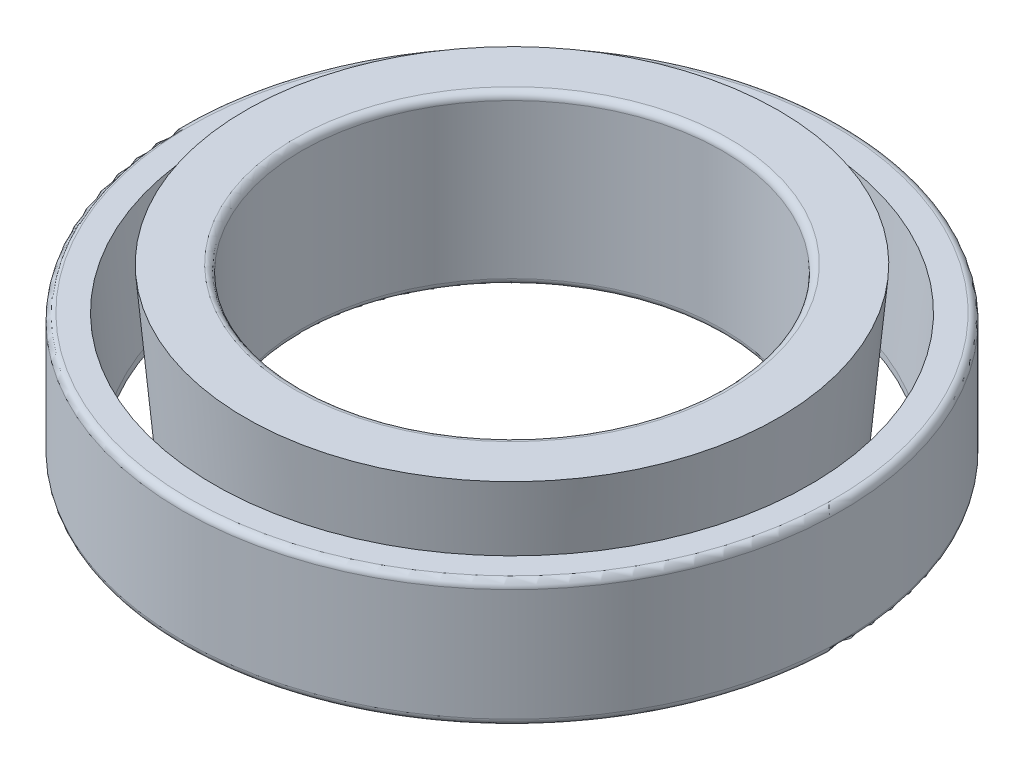
ISO-10303-21;
HEADER;
FILE_DESCRIPTION(('STEP AP214'),'2;1');
FILE_NAME('part.step','',(''),(''),'','','');
FILE_SCHEMA(('AUTOMOTIVE_DESIGN { 1 0 10303 214 1 1 1 1 }'));
ENDSEC;
DATA;
#1=APPLICATION_CONTEXT('core data for automotive mechanical design processes');
#2=APPLICATION_PROTOCOL_DEFINITION('international standard','automotive_design',2000,#1);
#3=PRODUCT_CONTEXT('',#1,'mechanical');
#4=PRODUCT('Part','Part','',(#3));
#5=PRODUCT_RELATED_PRODUCT_CATEGORY('part','',(#4));
#6=PRODUCT_DEFINITION_FORMATION('','',#4);
#7=PRODUCT_DEFINITION_CONTEXT('part definition',#1,'design');
#8=PRODUCT_DEFINITION('design','',#6,#7);
#9=PRODUCT_DEFINITION_SHAPE('','',#8);
#10=(LENGTH_UNIT() NAMED_UNIT(*) SI_UNIT(.MILLI.,.METRE.));
#11=(NAMED_UNIT(*) PLANE_ANGLE_UNIT() SI_UNIT($,.RADIAN.));
#12=(NAMED_UNIT(*) SI_UNIT($,.STERADIAN.) SOLID_ANGLE_UNIT());
#13=UNCERTAINTY_MEASURE_WITH_UNIT(LENGTH_MEASURE(1.E-05),#10,'distance_accuracy_value','');
#14=(GEOMETRIC_REPRESENTATION_CONTEXT(3) GLOBAL_UNCERTAINTY_ASSIGNED_CONTEXT((#13)) GLOBAL_UNIT_ASSIGNED_CONTEXT((#10,
#11,#12)) REPRESENTATION_CONTEXT('',''));
#15=CARTESIAN_POINT('',(0.,0.,0.));
#16=DIRECTION('',(0.,0.,1.));
#17=DIRECTION('',(1.,0.,0.));
#18=AXIS2_PLACEMENT_3D('',#15,#16,#17);
#19=CARTESIAN_POINT('',(0.,9.,0.));
#20=DIRECTION('',(0.,1.,0.));
#21=DIRECTION('',(0.,0.,1.));
#22=AXIS2_PLACEMENT_3D('',#19,#20,#21);
#23=CONICAL_SURFACE('',#22,21.2554248969194,0.0787443021750792);
#24=CARTESIAN_POINT('',(0.,0.486829793710609,0.));
#25=DIRECTION('',(0.,-1.,0.));
#26=DIRECTION('',(0.,0.,-1.));
#27=AXIS2_PLACEMENT_3D('',#24,#25,#26);
#28=CIRCLE('',#27,20.5836722376769);
#29=CARTESIAN_POINT('',(0.,0.486829793710609,-20.5836722376769));
#30=VERTEX_POINT('',#29);
#31=EDGE_CURVE('E71',#30,#30,#28,.T.);
#32=ORIENTED_EDGE('',*,*,#31,.T.);
#33=EDGE_LOOP('',(#32));
#34=FACE_BOUND('',#33,.T.);
#35=CARTESIAN_POINT('',(0.,9.,0.));
#36=DIRECTION('',(0.,-1.,0.));
#37=DIRECTION('',(0.,0.,-1.));
#38=AXIS2_PLACEMENT_3D('',#35,#36,#37);
#39=CIRCLE('',#38,21.2554248969194);
#40=CARTESIAN_POINT('',(0.,9.,-21.2554248969194));
#41=VERTEX_POINT('',#40);
#42=EDGE_CURVE('E70',#41,#41,#39,.T.);
#43=ORIENTED_EDGE('',*,*,#42,.F.);
#44=EDGE_LOOP('',(#43));
#45=FACE_BOUND('',#44,.T.);
#46=ADVANCED_FACE('F50',(#34,#45),#23,.F.);
#47=CARTESIAN_POINT('',(21.2554248969194,9.,0.));
#48=DIRECTION('',(0.,1.,0.));
#49=DIRECTION('',(0.,0.,1.));
#50=AXIS2_PLACEMENT_3D('',#47,#48,#49);
#51=PLANE('',#50);
#52=CARTESIAN_POINT('',(0.,9.,0.));
#53=DIRECTION('',(0.,1.,0.));
#54=DIRECTION('',(0.,0.,1.));
#55=AXIS2_PLACEMENT_3D('',#52,#53,#54);
#56=CIRCLE('',#55,23.);
#57=CARTESIAN_POINT('',(0.,9.,23.));
#58=VERTEX_POINT('',#57);
#59=EDGE_CURVE('E11',#58,#58,#56,.T.);
#60=ORIENTED_EDGE('',*,*,#59,.T.);
#61=EDGE_LOOP('',(#60));
#62=FACE_BOUND('',#61,.T.);
#63=ORIENTED_EDGE('',*,*,#42,.T.);
#64=EDGE_LOOP('',(#63));
#65=FACE_BOUND('',#64,.T.);
#66=ADVANCED_FACE('F92',(#62,#65),#51,.T.);
#67=CARTESIAN_POINT('',(0.,0.,0.));
#68=DIRECTION('',(0.,-1.,0.));
#69=DIRECTION('',(0.,0.,-1.));
#70=AXIS2_PLACEMENT_3D('',#67,#68,#69);
#71=CYLINDRICAL_SURFACE('',#70,23.5);
#72=CARTESIAN_POINT('',(0.,0.5,0.));
#73=DIRECTION('',(0.,-1.,0.));
#74=DIRECTION('',(0.,0.,-1.));
#75=AXIS2_PLACEMENT_3D('',#72,#73,#74);
#76=CIRCLE('',#75,23.5);
#77=CARTESIAN_POINT('',(0.,0.5,-23.5));
#78=VERTEX_POINT('',#77);
#79=EDGE_CURVE('E53',#78,#78,#76,.F.);
#80=ORIENTED_EDGE('',*,*,#79,.T.);
#81=EDGE_LOOP('',(#80));
#82=FACE_BOUND('',#81,.T.);
#83=CARTESIAN_POINT('',(0.,8.5,0.));
#84=DIRECTION('',(0.,1.,0.));
#85=DIRECTION('',(0.,0.,1.));
#86=AXIS2_PLACEMENT_3D('',#83,#84,#85);
#87=CIRCLE('',#86,23.5);
#88=CARTESIAN_POINT('',(0.,8.5,23.5));
#89=VERTEX_POINT('',#88);
#90=EDGE_CURVE('E59',#89,#89,#87,.F.);
#91=ORIENTED_EDGE('',*,*,#90,.T.);
#92=EDGE_LOOP('',(#91));
#93=FACE_BOUND('',#92,.T.);
#94=ADVANCED_FACE('F95',(#82,#93),#71,.T.);
#95=CARTESIAN_POINT('',(23.5,0.,0.));
#96=DIRECTION('',(0.,-1.,0.));
#97=DIRECTION('',(0.,0.,-1.));
#98=AXIS2_PLACEMENT_3D('',#95,#96,#97);
#99=PLANE('',#98);
#100=CARTESIAN_POINT('',(0.,0.,0.));
#101=DIRECTION('',(0.,-1.,0.));
#102=DIRECTION('',(0.,0.,-1.));
#103=AXIS2_PLACEMENT_3D('',#100,#101,#102);
#104=CIRCLE('',#103,23.);
#105=CARTESIAN_POINT('',(0.,0.,-23.));
#106=VERTEX_POINT('',#105);
#107=EDGE_CURVE('E65',#106,#106,#104,.T.);
#108=ORIENTED_EDGE('',*,*,#107,.T.);
#109=EDGE_LOOP('',(#108));
#110=FACE_BOUND('',#109,.T.);
#111=CARTESIAN_POINT('',(0.,0.,0.));
#112=DIRECTION('',(0.,-1.,0.));
#113=DIRECTION('',(0.,0.,-1.));
#114=AXIS2_PLACEMENT_3D('',#111,#112,#113);
#115=CIRCLE('',#114,20.5836722376769);
#116=CARTESIAN_POINT('',(0.,0.,-20.5836722376769));
#117=VERTEX_POINT('',#116);
#118=EDGE_CURVE('E69',#117,#117,#115,.T.);
#119=ORIENTED_EDGE('',*,*,#118,.F.);
#120=EDGE_LOOP('',(#119));
#121=FACE_BOUND('',#120,.T.);
#122=ADVANCED_FACE('F85',(#110,#121),#99,.T.);
#123=CARTESIAN_POINT('',(0.,0.,0.));
#124=DIRECTION('',(0.,-1.,0.));
#125=DIRECTION('',(0.,0.,-1.));
#126=AXIS2_PLACEMENT_3D('',#123,#124,#125);
#127=CYLINDRICAL_SURFACE('',#126,20.5836722376769);
#128=ORIENTED_EDGE('',*,*,#118,.T.);
#129=EDGE_LOOP('',(#128));
#130=FACE_BOUND('',#129,.T.);
#131=ORIENTED_EDGE('',*,*,#31,.F.);
#132=EDGE_LOOP('',(#131));
#133=FACE_BOUND('',#132,.T.);
#134=ADVANCED_FACE('F79',(#130,#133),#127,.F.);
#135=CARTESIAN_POINT('',(0.,0.5,0.));
#136=DIRECTION('',(0.,-1.,0.));
#137=DIRECTION('',(0.,0.,-1.));
#138=AXIS2_PLACEMENT_3D('',#135,#136,#137);
#139=TOROIDAL_SURFACE('',#138,23.,0.5);
#140=ORIENTED_EDGE('',*,*,#79,.F.);
#141=EDGE_LOOP('',(#140));
#142=FACE_BOUND('',#141,.T.);
#143=ORIENTED_EDGE('',*,*,#107,.F.);
#144=EDGE_LOOP('',(#143));
#145=FACE_BOUND('',#144,.T.);
#146=ADVANCED_FACE('F81',(#142,#145),#139,.T.);
#147=CARTESIAN_POINT('',(0.,8.5,0.));
#148=DIRECTION('',(0.,1.,0.));
#149=DIRECTION('',(0.,0.,1.));
#150=AXIS2_PLACEMENT_3D('',#147,#148,#149);
#151=TOROIDAL_SURFACE('',#150,23.,0.5);
#152=ORIENTED_EDGE('',*,*,#59,.F.);
#153=EDGE_LOOP('',(#152));
#154=FACE_BOUND('',#153,.T.);
#155=ORIENTED_EDGE('',*,*,#90,.F.);
#156=EDGE_LOOP('',(#155));
#157=FACE_BOUND('',#156,.T.);
#158=ADVANCED_FACE('F47',(#154,#157),#151,.T.);
#159=CLOSED_SHELL('',(#46,#66,#94,#122,#134,#146,#158));
#160=MANIFOLD_SOLID_BREP('B2',#159);
#161=CARTESIAN_POINT('',(17.9464729595348,-0.0131702062893918,0.));
#162=DIRECTION('',(0.,-1.,0.));
#163=DIRECTION('',(0.,0.,-1.));
#164=AXIS2_PLACEMENT_3D('',#161,#162,#163);
#165=PLANE('',#164);
#166=CARTESIAN_POINT('',(0.,-0.0131702062893918,0.));
#167=DIRECTION('',(0.,-1.,0.));
#168=DIRECTION('',(0.,0.,-1.));
#169=AXIS2_PLACEMENT_3D('',#166,#167,#168);
#170=CIRCLE('',#169,15.5);
#171=CARTESIAN_POINT('',(0.,-0.0131702062893918,-15.5));
#172=VERTEX_POINT('',#171);
#173=EDGE_CURVE('E161',#172,#172,#170,.F.);
#174=ORIENTED_EDGE('',*,*,#173,.T.);
#175=EDGE_LOOP('',(#174));
#176=FACE_BOUND('',#175,.T.);
#177=CARTESIAN_POINT('',(0.,-0.0131702062893917,0.));
#178=DIRECTION('',(0.,-1.,0.));
#179=DIRECTION('',(0.,0.,-1.));
#180=AXIS2_PLACEMENT_3D('',#177,#178,#179);
#181=CIRCLE('',#180,17.9464729595348);
#182=CARTESIAN_POINT('',(0.,-0.0131702062893917,-17.9464729595348));
#183=VERTEX_POINT('',#182);
#184=EDGE_CURVE('E180',#183,#183,#181,.T.);
#185=ORIENTED_EDGE('',*,*,#184,.T.);
#186=EDGE_LOOP('',(#185));
#187=FACE_BOUND('',#186,.T.);
#188=ADVANCED_FACE('F152',(#176,#187),#165,.T.);
#189=CARTESIAN_POINT('',(0.,0.,0.));
#190=DIRECTION('',(0.,-1.,0.));
#191=DIRECTION('',(0.,0.,-1.));
#192=AXIS2_PLACEMENT_3D('',#189,#190,#191);
#193=CYLINDRICAL_SURFACE('',#192,15.);
#194=CARTESIAN_POINT('',(0.,0.486829793710608,0.));
#195=DIRECTION('',(0.,-1.,0.));
#196=DIRECTION('',(0.,0.,-1.));
#197=AXIS2_PLACEMENT_3D('',#194,#195,#196);
#198=CIRCLE('',#197,15.);
#199=CARTESIAN_POINT('',(0.,0.486829793710608,-15.));
#200=VERTEX_POINT('',#199);
#201=EDGE_CURVE('E164',#200,#200,#198,.T.);
#202=ORIENTED_EDGE('',*,*,#201,.T.);
#203=EDGE_LOOP('',(#202));
#204=FACE_BOUND('',#203,.T.);
#205=CARTESIAN_POINT('',(0.,11.4868297937106,0.));
#206=DIRECTION('',(0.,1.,0.));
#207=DIRECTION('',(0.,0.,1.));
#208=AXIS2_PLACEMENT_3D('',#205,#206,#207);
#209=CIRCLE('',#208,15.);
#210=CARTESIAN_POINT('',(0.,11.4868297937106,15.));
#211=VERTEX_POINT('',#210);
#212=EDGE_CURVE('E166',#211,#211,#209,.T.);
#213=ORIENTED_EDGE('',*,*,#212,.T.);
#214=EDGE_LOOP('',(#213));
#215=FACE_BOUND('',#214,.T.);
#216=ADVANCED_FACE('F193',(#204,#215),#193,.F.);
#217=CARTESIAN_POINT('',(15.,11.9868297937106,0.));
#218=DIRECTION('',(0.,1.,0.));
#219=DIRECTION('',(0.,0.,1.));
#220=AXIS2_PLACEMENT_3D('',#217,#218,#219);
#221=PLANE('',#220);
#222=CARTESIAN_POINT('',(0.,11.9868297937106,0.));
#223=DIRECTION('',(0.,1.,0.));
#224=DIRECTION('',(0.,0.,1.));
#225=AXIS2_PLACEMENT_3D('',#222,#223,#224);
#226=CIRCLE('',#225,15.5);
#227=CARTESIAN_POINT('',(0.,11.9868297937106,15.5));
#228=VERTEX_POINT('',#227);
#229=EDGE_CURVE('E46',#228,#228,#226,.F.);
#230=ORIENTED_EDGE('',*,*,#229,.T.);
#231=EDGE_LOOP('',(#230));
#232=FACE_BOUND('',#231,.T.);
#233=CARTESIAN_POINT('',(0.,11.9868297937106,0.));
#234=DIRECTION('',(0.,-1.,0.));
#235=DIRECTION('',(0.,0.,-1.));
#236=AXIS2_PLACEMENT_3D('',#233,#234,#235);
#237=CIRCLE('',#236,19.);
#238=CARTESIAN_POINT('',(0.,11.9868297937106,-19.));
#239=VERTEX_POINT('',#238);
#240=EDGE_CURVE('E174',#239,#239,#237,.T.);
#241=ORIENTED_EDGE('',*,*,#240,.F.);
#242=EDGE_LOOP('',(#241));
#243=FACE_BOUND('',#242,.T.);
#244=ADVANCED_FACE('F183',(#232,#243),#221,.T.);
#245=CARTESIAN_POINT('',(0.,-0.0131702062893917,0.));
#246=DIRECTION('',(0.,1.,0.));
#247=DIRECTION('',(0.,0.,1.));
#248=AXIS2_PLACEMENT_3D('',#245,#246,#247);
#249=CONICAL_SURFACE('',#248,17.9464729595348,0.0875693923083879);
#250=ORIENTED_EDGE('',*,*,#240,.T.);
#251=EDGE_LOOP('',(#250));
#252=FACE_BOUND('',#251,.T.);
#253=ORIENTED_EDGE('',*,*,#184,.F.);
#254=EDGE_LOOP('',(#253));
#255=FACE_BOUND('',#254,.T.);
#256=ADVANCED_FACE('F185',(#252,#255),#249,.T.);
#257=CARTESIAN_POINT('',(0.,0.486829793710608,0.));
#258=DIRECTION('',(0.,-1.,0.));
#259=DIRECTION('',(0.,0.,-1.));
#260=AXIS2_PLACEMENT_3D('',#257,#258,#259);
#261=TOROIDAL_SURFACE('',#260,15.5,0.5);
#262=ORIENTED_EDGE('',*,*,#173,.F.);
#263=EDGE_LOOP('',(#262));
#264=FACE_BOUND('',#263,.T.);
#265=ORIENTED_EDGE('',*,*,#201,.F.);
#266=EDGE_LOOP('',(#265));
#267=FACE_BOUND('',#266,.T.);
#268=ADVANCED_FACE('F184',(#264,#267),#261,.T.);
#269=CARTESIAN_POINT('',(0.,11.4868297937106,0.));
#270=DIRECTION('',(0.,1.,0.));
#271=DIRECTION('',(0.,0.,1.));
#272=AXIS2_PLACEMENT_3D('',#269,#270,#271);
#273=TOROIDAL_SURFACE('',#272,15.5,0.5);
#274=ORIENTED_EDGE('',*,*,#212,.F.);
#275=EDGE_LOOP('',(#274));
#276=FACE_BOUND('',#275,.T.);
#277=ORIENTED_EDGE('',*,*,#229,.F.);
#278=EDGE_LOOP('',(#277));
#279=FACE_BOUND('',#278,.T.);
#280=ADVANCED_FACE('F156',(#276,#279),#273,.T.);
#281=CLOSED_SHELL('',(#188,#216,#244,#256,#268,#280));
#282=MANIFOLD_SOLID_BREP('B6',#281);
#283=ADVANCED_BREP_SHAPE_REPRESENTATION('',(#18,#160,#282),#14);
#284=SHAPE_DEFINITION_REPRESENTATION(#9,#283);
ENDSEC;
END-ISO-10303-21;
